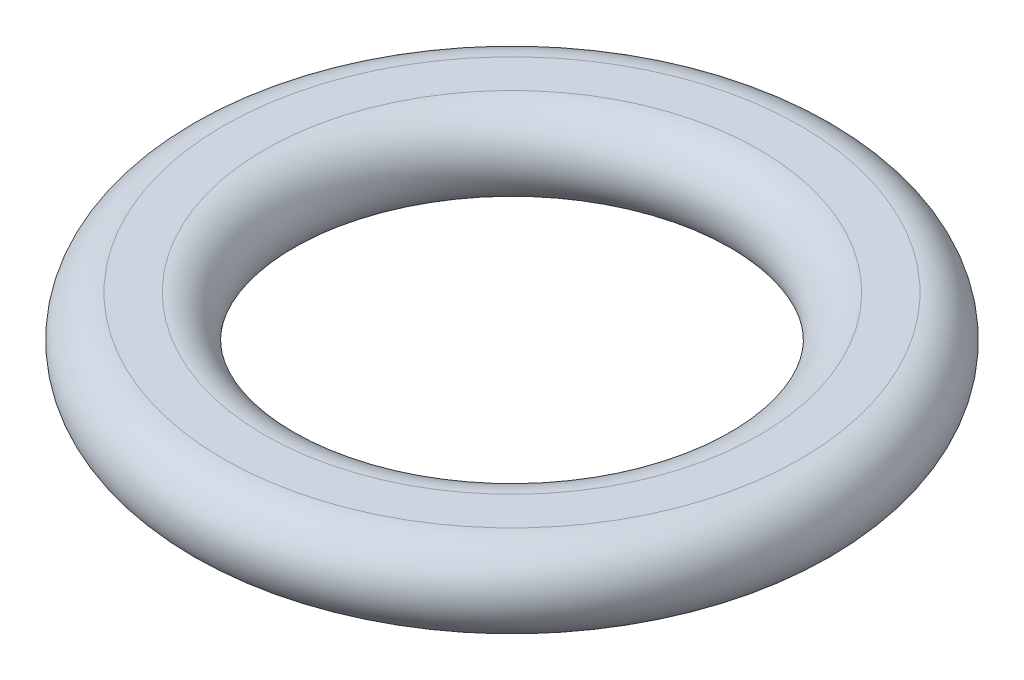
ISO-10303-21;
HEADER;
FILE_DESCRIPTION(('STEP AP214'),'2;1');
FILE_NAME('part.step','',(''),(''),'','','');
FILE_SCHEMA(('AUTOMOTIVE_DESIGN { 1 0 10303 214 1 1 1 1 }'));
ENDSEC;
DATA;
#1=APPLICATION_CONTEXT('core data for automotive mechanical design processes');
#2=APPLICATION_PROTOCOL_DEFINITION('international standard','automotive_design',2000,#1);
#3=PRODUCT_CONTEXT('',#1,'mechanical');
#4=PRODUCT('Part','Part','',(#3));
#5=PRODUCT_RELATED_PRODUCT_CATEGORY('part','',(#4));
#6=PRODUCT_DEFINITION_FORMATION('','',#4);
#7=PRODUCT_DEFINITION_CONTEXT('part definition',#1,'design');
#8=PRODUCT_DEFINITION('design','',#6,#7);
#9=PRODUCT_DEFINITION_SHAPE('','',#8);
#10=(LENGTH_UNIT() NAMED_UNIT(*) SI_UNIT(.MILLI.,.METRE.));
#11=(NAMED_UNIT(*) PLANE_ANGLE_UNIT() SI_UNIT($,.RADIAN.));
#12=(NAMED_UNIT(*) SI_UNIT($,.STERADIAN.) SOLID_ANGLE_UNIT());
#13=UNCERTAINTY_MEASURE_WITH_UNIT(LENGTH_MEASURE(1.E-05),#10,'distance_accuracy_value','');
#14=(GEOMETRIC_REPRESENTATION_CONTEXT(3) GLOBAL_UNCERTAINTY_ASSIGNED_CONTEXT((#13)) GLOBAL_UNIT_ASSIGNED_CONTEXT((#10,
#11,#12)) REPRESENTATION_CONTEXT('',''));
#15=CARTESIAN_POINT('',(0.,0.,0.));
#16=DIRECTION('',(0.,0.,1.));
#17=DIRECTION('',(1.,0.,0.));
#18=AXIS2_PLACEMENT_3D('',#15,#16,#17);
#19=CARTESIAN_POINT('',(0.,0.,0.));
#20=DIRECTION('',(0.,1.,0.));
#21=DIRECTION('',(0.,0.,1.));
#22=AXIS2_PLACEMENT_3D('',#19,#20,#21);
#23=TOROIDAL_SURFACE('',#22,3.,0.5);
#24=CARTESIAN_POINT('',(0.,-0.5,0.));
#25=DIRECTION('',(0.,1.,0.));
#26=DIRECTION('',(0.,0.,1.));
#27=AXIS2_PLACEMENT_3D('',#24,#25,#26);
#28=CIRCLE('',#27,3.);
#29=CARTESIAN_POINT('',(0.,-0.5,3.));
#30=VERTEX_POINT('',#29);
#31=EDGE_CURVE('E10',#30,#30,#28,.T.);
#32=ORIENTED_EDGE('',*,*,#31,.F.);
#33=EDGE_LOOP('',(#32));
#34=FACE_BOUND('',#33,.T.);
#35=CARTESIAN_POINT('',(0.,0.5,0.));
#36=DIRECTION('',(0.,1.,0.));
#37=DIRECTION('',(0.,0.,1.));
#38=AXIS2_PLACEMENT_3D('',#35,#36,#37);
#39=CIRCLE('',#38,3.);
#40=CARTESIAN_POINT('',(0.,0.5,3.));
#41=VERTEX_POINT('',#40);
#42=EDGE_CURVE('E44',#41,#41,#39,.T.);
#43=ORIENTED_EDGE('',*,*,#42,.T.);
#44=EDGE_LOOP('',(#43));
#45=FACE_BOUND('',#44,.T.);
#46=ADVANCED_FACE('F30',(#34,#45),#23,.T.);
#47=CARTESIAN_POINT('',(3.,-0.5,0.));
#48=DIRECTION('',(0.,1.,0.));
#49=DIRECTION('',(0.,0.,1.));
#50=AXIS2_PLACEMENT_3D('',#47,#48,#49);
#51=PLANE('',#50);
#52=CARTESIAN_POINT('',(0.,-0.5,0.));
#53=DIRECTION('',(0.,1.,0.));
#54=DIRECTION('',(0.,0.,1.));
#55=AXIS2_PLACEMENT_3D('',#52,#53,#54);
#56=CIRCLE('',#55,3.5);
#57=CARTESIAN_POINT('',(0.,-0.5,3.5));
#58=VERTEX_POINT('',#57);
#59=EDGE_CURVE('E36',#58,#58,#56,.T.);
#60=ORIENTED_EDGE('',*,*,#59,.F.);
#61=EDGE_LOOP('',(#60));
#62=FACE_BOUND('',#61,.T.);
#63=ORIENTED_EDGE('',*,*,#31,.T.);
#64=EDGE_LOOP('',(#63));
#65=FACE_BOUND('',#64,.T.);
#66=ADVANCED_FACE('F59',(#62,#65),#51,.F.);
#67=CARTESIAN_POINT('',(0.,0.,0.));
#68=DIRECTION('',(0.,1.,0.));
#69=DIRECTION('',(0.,0.,1.));
#70=AXIS2_PLACEMENT_3D('',#67,#68,#69);
#71=TOROIDAL_SURFACE('',#70,3.5,0.5);
#72=CARTESIAN_POINT('',(0.,0.5,0.));
#73=DIRECTION('',(0.,1.,0.));
#74=DIRECTION('',(0.,0.,1.));
#75=AXIS2_PLACEMENT_3D('',#72,#73,#74);
#76=CIRCLE('',#75,3.5);
#77=CARTESIAN_POINT('',(0.,0.5,3.5));
#78=VERTEX_POINT('',#77);
#79=EDGE_CURVE('E40',#78,#78,#76,.T.);
#80=ORIENTED_EDGE('',*,*,#79,.F.);
#81=EDGE_LOOP('',(#80));
#82=FACE_BOUND('',#81,.T.);
#83=ORIENTED_EDGE('',*,*,#59,.T.);
#84=EDGE_LOOP('',(#83));
#85=FACE_BOUND('',#84,.T.);
#86=ADVANCED_FACE('F54',(#82,#85),#71,.T.);
#87=CARTESIAN_POINT('',(3.,0.5,0.));
#88=DIRECTION('',(0.,-1.,0.));
#89=DIRECTION('',(0.,0.,-1.));
#90=AXIS2_PLACEMENT_3D('',#87,#88,#89);
#91=PLANE('',#90);
#92=ORIENTED_EDGE('',*,*,#42,.F.);
#93=EDGE_LOOP('',(#92));
#94=FACE_BOUND('',#93,.T.);
#95=ORIENTED_EDGE('',*,*,#79,.T.);
#96=EDGE_LOOP('',(#95));
#97=FACE_BOUND('',#96,.T.);
#98=ADVANCED_FACE('F51',(#94,#97),#91,.F.);
#99=CLOSED_SHELL('',(#46,#66,#86,#98));
#100=MANIFOLD_SOLID_BREP('B2',#99);
#101=ADVANCED_BREP_SHAPE_REPRESENTATION('',(#18,#100),#14);
#102=SHAPE_DEFINITION_REPRESENTATION(#9,#101);
ENDSEC;
END-ISO-10303-21;
